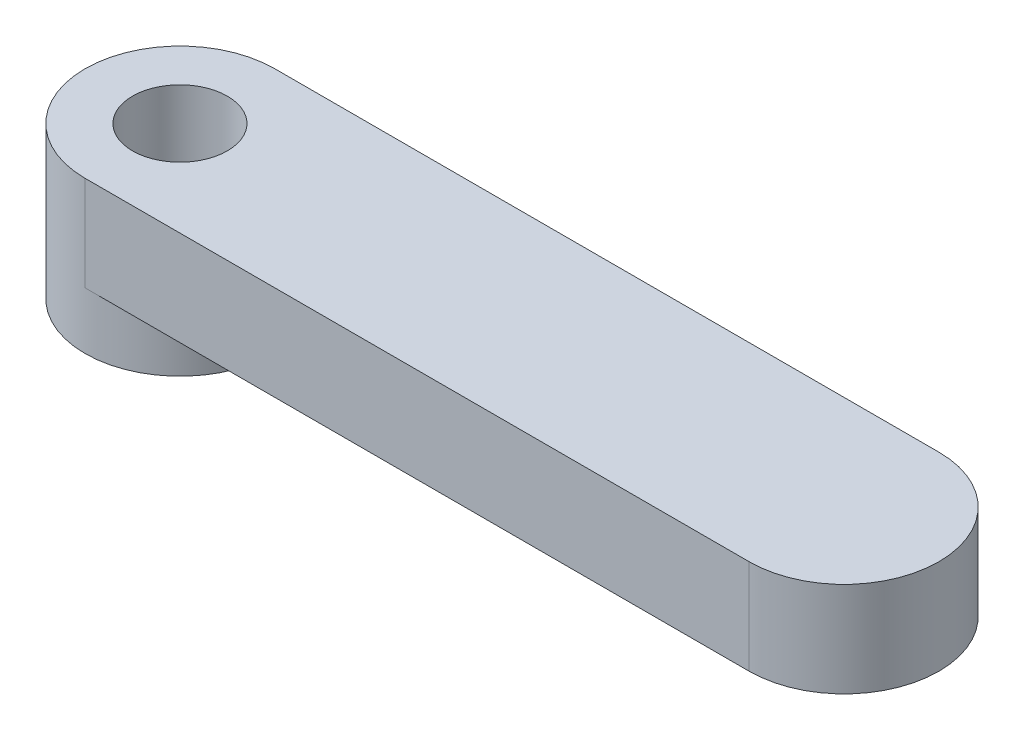
ISO-10303-21;
HEADER;
FILE_DESCRIPTION(('STEP AP214'),'2;1');
FILE_NAME('part.step','',(''),(''),'','','');
FILE_SCHEMA(('AUTOMOTIVE_DESIGN { 1 0 10303 214 1 1 1 1 }'));
ENDSEC;
DATA;
#1=APPLICATION_CONTEXT('core data for automotive mechanical design processes');
#2=APPLICATION_PROTOCOL_DEFINITION('international standard','automotive_design',2000,#1);
#3=PRODUCT_CONTEXT('',#1,'mechanical');
#4=PRODUCT('Part','Part','',(#3));
#5=PRODUCT_RELATED_PRODUCT_CATEGORY('part','',(#4));
#6=PRODUCT_DEFINITION_FORMATION('','',#4);
#7=PRODUCT_DEFINITION_CONTEXT('part definition',#1,'design');
#8=PRODUCT_DEFINITION('design','',#6,#7);
#9=PRODUCT_DEFINITION_SHAPE('','',#8);
#10=(LENGTH_UNIT() NAMED_UNIT(*) SI_UNIT(.MILLI.,.METRE.));
#11=(NAMED_UNIT(*) PLANE_ANGLE_UNIT() SI_UNIT($,.RADIAN.));
#12=(NAMED_UNIT(*) SI_UNIT($,.STERADIAN.) SOLID_ANGLE_UNIT());
#13=UNCERTAINTY_MEASURE_WITH_UNIT(LENGTH_MEASURE(1.E-05),#10,'distance_accuracy_value','');
#14=(GEOMETRIC_REPRESENTATION_CONTEXT(3) GLOBAL_UNCERTAINTY_ASSIGNED_CONTEXT((#13)) GLOBAL_UNIT_ASSIGNED_CONTEXT((#10,
#11,#12)) REPRESENTATION_CONTEXT('',''));
#15=CARTESIAN_POINT('',(0.,0.,0.));
#16=DIRECTION('',(0.,0.,1.));
#17=DIRECTION('',(1.,0.,0.));
#18=AXIS2_PLACEMENT_3D('',#15,#16,#17);
#19=CARTESIAN_POINT('',(-34.3029450895198,0.,11.0156134358354));
#20=DIRECTION('',(0.,1.,0.));
#21=DIRECTION('',(0.,0.,1.));
#22=AXIS2_PLACEMENT_3D('',#19,#20,#21);
#23=PLANE('',#22);
#24=CARTESIAN_POINT('',(-34.3029450895198,0.,11.0156134358354));
#25=DIRECTION('',(0.,-1.,0.));
#26=DIRECTION('',(0.,0.,-1.));
#27=AXIS2_PLACEMENT_3D('',#24,#25,#26);
#28=CIRCLE('',#27,5.);
#29=CARTESIAN_POINT('',(-34.3029450895198,0.,6.01561343583539));
#30=VERTEX_POINT('',#29);
#31=CARTESIAN_POINT('',(-34.3029450895198,0.,16.0156134358354));
#32=VERTEX_POINT('',#31);
#33=EDGE_CURVE('E92',#30,#32,#28,.T.);
#34=ORIENTED_EDGE('',*,*,#33,.F.);
#35=DIRECTION('',(-1.,0.,0.));
#36=VECTOR('',#35,1.);
#37=CARTESIAN_POINT('',(-34.3029450895198,0.,6.01561343583539));
#38=LINE('',#37,#36);
#39=CARTESIAN_POINT('',(0.697054910480222,0.,6.01561343583539));
#40=VERTEX_POINT('',#39);
#41=EDGE_CURVE('E94',#40,#30,#38,.T.);
#42=ORIENTED_EDGE('',*,*,#41,.F.);
#43=CARTESIAN_POINT('',(0.697054910480222,0.,11.0156134358354));
#44=DIRECTION('',(0.,1.,0.));
#45=DIRECTION('',(0.,0.,1.));
#46=AXIS2_PLACEMENT_3D('',#43,#44,#45);
#47=CIRCLE('',#46,5.);
#48=CARTESIAN_POINT('',(0.697054910480222,0.,16.0156134358354));
#49=VERTEX_POINT('',#48);
#50=EDGE_CURVE('E82',#49,#40,#47,.T.);
#51=ORIENTED_EDGE('',*,*,#50,.F.);
#52=DIRECTION('',(1.,0.,0.));
#53=VECTOR('',#52,1.);
#54=CARTESIAN_POINT('',(-34.3029450895198,0.,16.0156134358354));
#55=LINE('',#54,#53);
#56=EDGE_CURVE('E75',#32,#49,#55,.T.);
#57=ORIENTED_EDGE('',*,*,#56,.F.);
#58=EDGE_LOOP('',(#34,#42,#51,#57));
#59=FACE_BOUND('',#58,.T.);
#60=ADVANCED_FACE('F43',(#59),#23,.F.);
#61=CARTESIAN_POINT('',(-34.3029450895198,5.,11.0156134358354));
#62=DIRECTION('',(0.,1.,0.));
#63=DIRECTION('',(0.,0.,1.));
#64=AXIS2_PLACEMENT_3D('',#61,#62,#63);
#65=PLANE('',#64);
#66=CARTESIAN_POINT('',(-34.3029450895198,5.,11.0156134358354));
#67=DIRECTION('',(0.,1.,0.));
#68=DIRECTION('',(0.,0.,1.));
#69=AXIS2_PLACEMENT_3D('',#66,#67,#68);
#70=CIRCLE('',#69,5.);
#71=CARTESIAN_POINT('',(-34.3029450895198,5.,6.01561343583539));
#72=VERTEX_POINT('',#71);
#73=CARTESIAN_POINT('',(-34.3029450895198,5.,16.0156134358354));
#74=VERTEX_POINT('',#73);
#75=EDGE_CURVE('E108',#72,#74,#70,.T.);
#76=ORIENTED_EDGE('',*,*,#75,.T.);
#77=DIRECTION('',(1.,0.,0.));
#78=VECTOR('',#77,1.);
#79=CARTESIAN_POINT('',(-34.3029450895198,5.,16.0156134358354));
#80=LINE('',#79,#78);
#81=CARTESIAN_POINT('',(0.697054910480222,5.,16.0156134358354));
#82=VERTEX_POINT('',#81);
#83=EDGE_CURVE('E87',#74,#82,#80,.T.);
#84=ORIENTED_EDGE('',*,*,#83,.T.);
#85=CARTESIAN_POINT('',(0.697054910480222,5.,11.0156134358354));
#86=DIRECTION('',(0.,1.,0.));
#87=DIRECTION('',(0.,0.,1.));
#88=AXIS2_PLACEMENT_3D('',#85,#86,#87);
#89=CIRCLE('',#88,5.);
#90=CARTESIAN_POINT('',(0.697054910480222,5.,6.01561343583539));
#91=VERTEX_POINT('',#90);
#92=EDGE_CURVE('E116',#82,#91,#89,.T.);
#93=ORIENTED_EDGE('',*,*,#92,.T.);
#94=DIRECTION('',(-1.,0.,0.));
#95=VECTOR('',#94,1.);
#96=CARTESIAN_POINT('',(-34.3029450895198,5.,6.01561343583539));
#97=LINE('',#96,#95);
#98=EDGE_CURVE('E61',#91,#72,#97,.T.);
#99=ORIENTED_EDGE('',*,*,#98,.T.);
#100=EDGE_LOOP('',(#76,#84,#93,#99));
#101=FACE_BOUND('',#100,.T.);
#102=CARTESIAN_POINT('',(-34.3029450895198,5.,11.0156134358354));
#103=DIRECTION('',(0.,1.,0.));
#104=DIRECTION('',(0.,0.,1.));
#105=AXIS2_PLACEMENT_3D('',#102,#103,#104);
#106=CIRCLE('',#105,2.5);
#107=CARTESIAN_POINT('',(-34.3029450895198,5.,13.5156134358354));
#108=VERTEX_POINT('',#107);
#109=EDGE_CURVE('E124',#108,#108,#106,.T.);
#110=ORIENTED_EDGE('',*,*,#109,.F.);
#111=EDGE_LOOP('',(#110));
#112=FACE_BOUND('',#111,.T.);
#113=ADVANCED_FACE('F155',(#101,#112),#65,.T.);
#114=CARTESIAN_POINT('',(-34.3029450895198,5.,11.0156134358354));
#115=DIRECTION('',(0.,-1.,0.));
#116=DIRECTION('',(0.,0.,-1.));
#117=AXIS2_PLACEMENT_3D('',#114,#115,#116);
#118=CYLINDRICAL_SURFACE('',#117,5.);
#119=DIRECTION('',(0.,-1.,0.));
#120=VECTOR('',#119,1.);
#121=CARTESIAN_POINT('',(-34.3029450895198,5.,6.01561343583539));
#122=LINE('',#121,#120);
#123=EDGE_CURVE('E104',#72,#30,#122,.T.);
#124=ORIENTED_EDGE('',*,*,#123,.T.);
#125=ORIENTED_EDGE('',*,*,#33,.T.);
#126=DIRECTION('',(0.,-1.,0.));
#127=VECTOR('',#126,1.);
#128=CARTESIAN_POINT('',(-34.3029450895198,5.,16.0156134358354));
#129=LINE('',#128,#127);
#130=EDGE_CURVE('E12',#74,#32,#129,.T.);
#131=ORIENTED_EDGE('',*,*,#130,.F.);
#132=ORIENTED_EDGE('',*,*,#75,.F.);
#133=EDGE_LOOP('',(#124,#125,#131,#132));
#134=FACE_BOUND('',#133,.T.);
#135=CARTESIAN_POINT('',(-34.3029450895198,-3.,11.0156134358354));
#136=DIRECTION('',(0.,-1.,0.));
#137=DIRECTION('',(0.,0.,-1.));
#138=AXIS2_PLACEMENT_3D('',#135,#136,#137);
#139=CIRCLE('',#138,5.);
#140=CARTESIAN_POINT('',(-34.3029450895198,-3.,6.01561343583539));
#141=VERTEX_POINT('',#140);
#142=EDGE_CURVE('E99',#141,#141,#139,.T.);
#143=ORIENTED_EDGE('',*,*,#142,.F.);
#144=EDGE_LOOP('',(#143));
#145=FACE_BOUND('',#144,.T.);
#146=ADVANCED_FACE('F45',(#134,#145),#118,.T.);
#147=CARTESIAN_POINT('',(-34.3029450895198,5.,16.0156134358354));
#148=DIRECTION('',(0.,0.,-1.));
#149=DIRECTION('',(-1.,0.,0.));
#150=AXIS2_PLACEMENT_3D('',#147,#148,#149);
#151=PLANE('',#150);
#152=ORIENTED_EDGE('',*,*,#56,.T.);
#153=DIRECTION('',(0.,-1.,0.));
#154=VECTOR('',#153,1.);
#155=CARTESIAN_POINT('',(0.697054910480222,5.,16.0156134358354));
#156=LINE('',#155,#154);
#157=EDGE_CURVE('E53',#82,#49,#156,.T.);
#158=ORIENTED_EDGE('',*,*,#157,.F.);
#159=ORIENTED_EDGE('',*,*,#83,.F.);
#160=ORIENTED_EDGE('',*,*,#130,.T.);
#161=EDGE_LOOP('',(#152,#158,#159,#160));
#162=FACE_BOUND('',#161,.T.);
#163=ADVANCED_FACE('F165',(#162),#151,.F.);
#164=CARTESIAN_POINT('',(0.697054910480222,5.,11.0156134358354));
#165=DIRECTION('',(0.,-1.,0.));
#166=DIRECTION('',(0.,0.,-1.));
#167=AXIS2_PLACEMENT_3D('',#164,#165,#166);
#168=CYLINDRICAL_SURFACE('',#167,5.);
#169=ORIENTED_EDGE('',*,*,#50,.T.);
#170=DIRECTION('',(0.,-1.,0.));
#171=VECTOR('',#170,1.);
#172=CARTESIAN_POINT('',(0.697054910480222,5.,6.01561343583539));
#173=LINE('',#172,#171);
#174=EDGE_CURVE('E106',#91,#40,#173,.T.);
#175=ORIENTED_EDGE('',*,*,#174,.F.);
#176=ORIENTED_EDGE('',*,*,#92,.F.);
#177=ORIENTED_EDGE('',*,*,#157,.T.);
#178=EDGE_LOOP('',(#169,#175,#176,#177));
#179=FACE_BOUND('',#178,.T.);
#180=ADVANCED_FACE('F121',(#179),#168,.T.);
#181=CARTESIAN_POINT('',(-34.3029450895198,5.,6.01561343583539));
#182=DIRECTION('',(0.,0.,1.));
#183=DIRECTION('',(1.,0.,0.));
#184=AXIS2_PLACEMENT_3D('',#181,#182,#183);
#185=PLANE('',#184);
#186=ORIENTED_EDGE('',*,*,#41,.T.);
#187=ORIENTED_EDGE('',*,*,#123,.F.);
#188=ORIENTED_EDGE('',*,*,#98,.F.);
#189=ORIENTED_EDGE('',*,*,#174,.T.);
#190=EDGE_LOOP('',(#186,#187,#188,#189));
#191=FACE_BOUND('',#190,.T.);
#192=ADVANCED_FACE('F103',(#191),#185,.F.);
#193=CARTESIAN_POINT('',(-34.3029450895198,5.,11.0156134358354));
#194=DIRECTION('',(0.,-1.,0.));
#195=DIRECTION('',(0.,0.,-1.));
#196=AXIS2_PLACEMENT_3D('',#193,#194,#195);
#197=CYLINDRICAL_SURFACE('',#196,2.5);
#198=ORIENTED_EDGE('',*,*,#109,.T.);
#199=EDGE_LOOP('',(#198));
#200=FACE_BOUND('',#199,.T.);
#201=CARTESIAN_POINT('',(-34.3029450895198,-3.,11.0156134358354));
#202=DIRECTION('',(0.,-1.,0.));
#203=DIRECTION('',(0.,0.,-1.));
#204=AXIS2_PLACEMENT_3D('',#201,#202,#203);
#205=CIRCLE('',#204,2.5);
#206=CARTESIAN_POINT('',(-34.3029450895198,-3.,8.51561343583539));
#207=VERTEX_POINT('',#206);
#208=EDGE_CURVE('E100',#207,#207,#205,.T.);
#209=ORIENTED_EDGE('',*,*,#208,.T.);
#210=EDGE_LOOP('',(#209));
#211=FACE_BOUND('',#210,.T.);
#212=ADVANCED_FACE('F143',(#200,#211),#197,.F.);
#213=CARTESIAN_POINT('',(-34.3029450895198,-3.,11.0156134358354));
#214=DIRECTION('',(0.,-1.,0.));
#215=DIRECTION('',(0.,0.,-1.));
#216=AXIS2_PLACEMENT_3D('',#213,#214,#215);
#217=PLANE('',#216);
#218=ORIENTED_EDGE('',*,*,#142,.T.);
#219=EDGE_LOOP('',(#218));
#220=FACE_BOUND('',#219,.T.);
#221=ORIENTED_EDGE('',*,*,#208,.F.);
#222=EDGE_LOOP('',(#221));
#223=FACE_BOUND('',#222,.T.);
#224=ADVANCED_FACE('F145',(#220,#223),#217,.T.);
#225=CLOSED_SHELL('',(#60,#113,#146,#163,#180,#192,#212,#224));
#226=MANIFOLD_SOLID_BREP('B2',#225);
#227=ADVANCED_BREP_SHAPE_REPRESENTATION('',(#18,#226),#14);
#228=SHAPE_DEFINITION_REPRESENTATION(#9,#227);
ENDSEC;
END-ISO-10303-21;
